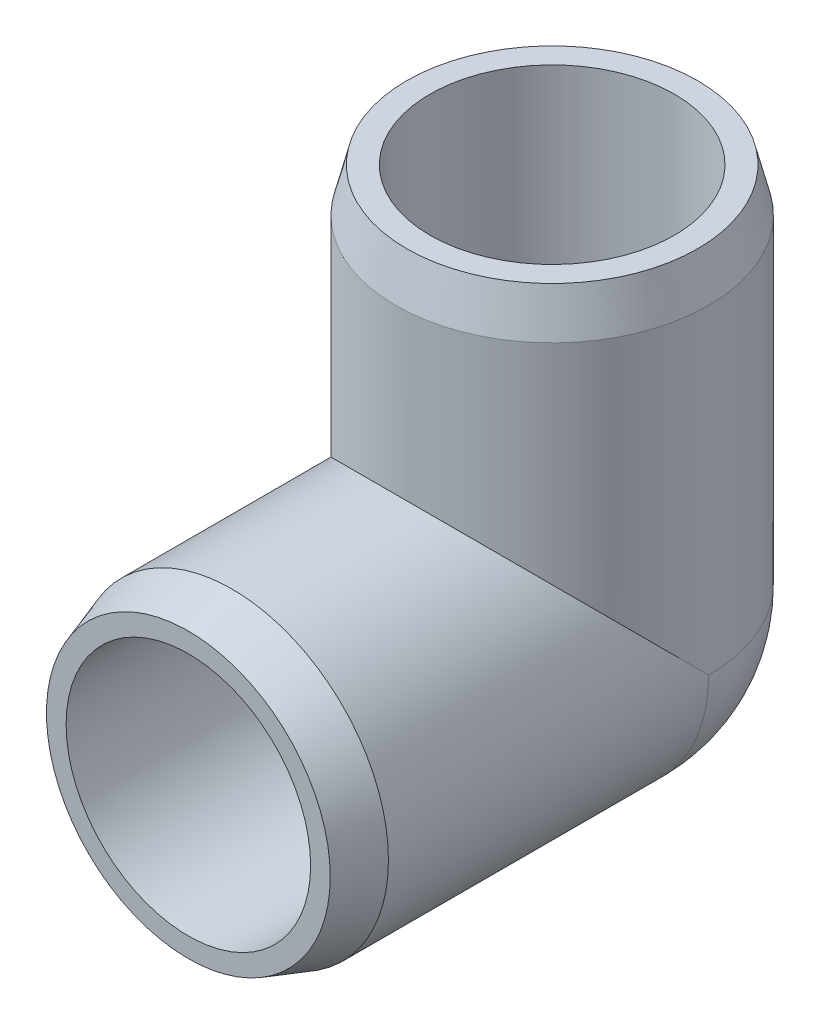
ISO-10303-21;
HEADER;
FILE_DESCRIPTION(('STEP AP214'),'2;1');
FILE_NAME('part.step','',(''),(''),'','','');
FILE_SCHEMA(('AUTOMOTIVE_DESIGN { 1 0 10303 214 1 1 1 1 }'));
ENDSEC;
DATA;
#1=APPLICATION_CONTEXT('core data for automotive mechanical design processes');
#2=APPLICATION_PROTOCOL_DEFINITION('international standard','automotive_design',2000,#1);
#3=PRODUCT_CONTEXT('',#1,'mechanical');
#4=PRODUCT('Part','Part','',(#3));
#5=PRODUCT_RELATED_PRODUCT_CATEGORY('part','',(#4));
#6=PRODUCT_DEFINITION_FORMATION('','',#4);
#7=PRODUCT_DEFINITION_CONTEXT('part definition',#1,'design');
#8=PRODUCT_DEFINITION('design','',#6,#7);
#9=PRODUCT_DEFINITION_SHAPE('','',#8);
#10=(LENGTH_UNIT() NAMED_UNIT(*) SI_UNIT(.MILLI.,.METRE.));
#11=(NAMED_UNIT(*) PLANE_ANGLE_UNIT() SI_UNIT($,.RADIAN.));
#12=(NAMED_UNIT(*) SI_UNIT($,.STERADIAN.) SOLID_ANGLE_UNIT());
#13=UNCERTAINTY_MEASURE_WITH_UNIT(LENGTH_MEASURE(1.E-05),#10,'distance_accuracy_value','');
#14=(GEOMETRIC_REPRESENTATION_CONTEXT(3) GLOBAL_UNCERTAINTY_ASSIGNED_CONTEXT((#13)) GLOBAL_UNIT_ASSIGNED_CONTEXT((#10,
#11,#12)) REPRESENTATION_CONTEXT('',''));
#15=CARTESIAN_POINT('',(0.,0.,0.));
#16=DIRECTION('',(0.,0.,1.));
#17=DIRECTION('',(1.,0.,0.));
#18=AXIS2_PLACEMENT_3D('',#15,#16,#17);
#19=CARTESIAN_POINT('',(0.,13.6525,-13.6535000000001));
#20=DIRECTION('',(0.,0.,1.));
#21=DIRECTION('',(1.,0.,0.));
#22=AXIS2_PLACEMENT_3D('',#19,#20,#21);
#23=CYLINDRICAL_SURFACE('',#22,13.6525);
#24=CARTESIAN_POINT('',(0.,13.6525,0.));
#25=DIRECTION('',(0.,0.,1.));
#26=DIRECTION('',(1.,0.,0.));
#27=AXIS2_PLACEMENT_3D('',#24,#25,#26);
#28=CIRCLE('',#27,13.6525);
#29=CARTESIAN_POINT('',(-13.6525,13.6525,0.));
#30=VERTEX_POINT('',#29);
#31=CARTESIAN_POINT('',(13.6525,13.6525,0.));
#32=VERTEX_POINT('',#31);
#33=EDGE_CURVE('E77',#30,#32,#28,.T.);
#34=ORIENTED_EDGE('',*,*,#33,.T.);
#35=CARTESIAN_POINT('',(0.,13.6525,0.));
#36=DIRECTION('',(0.,0.707106781186548,-0.707106781186547));
#37=DIRECTION('',(0.,0.707106781186548,0.707106781186547));
#38=AXIS2_PLACEMENT_3D('',#35,#36,#37);
#39=ELLIPSE('',#38,19.3075506602987,13.6525);
#40=EDGE_CURVE('E54',#32,#30,#39,.F.);
#41=ORIENTED_EDGE('',*,*,#40,.T.);
#42=EDGE_LOOP('',(#34,#41));
#43=FACE_BOUND('',#42,.T.);
#44=CARTESIAN_POINT('',(1.56818475708975E-13,13.6525,27.9399999999999));
#45=DIRECTION('',(0.,0.,1.));
#46=DIRECTION('',(1.,0.,0.));
#47=AXIS2_PLACEMENT_3D('',#44,#45,#46);
#48=CIRCLE('',#47,13.6525000000002);
#49=CARTESIAN_POINT('',(13.6525000000003,13.6525,27.9399999999996));
#50=VERTEX_POINT('',#49);
#51=EDGE_CURVE('E148',#50,#50,#48,.T.);
#52=ORIENTED_EDGE('',*,*,#51,.F.);
#53=EDGE_LOOP('',(#52));
#54=FACE_BOUND('',#53,.T.);
#55=ADVANCED_FACE('F33',(#43,#54),#23,.T.);
#56=CARTESIAN_POINT('',(2.21709065016539E-13,13.6525,31.75));
#57=DIRECTION('',(0.,0.,-1.));
#58=DIRECTION('',(-1.,0.,0.));
#59=AXIS2_PLACEMENT_3D('',#56,#57,#58);
#60=PLANE('',#59);
#61=CARTESIAN_POINT('',(2.21709065016539E-13,13.6525,31.75));
#62=DIRECTION('',(0.,0.,-1.));
#63=DIRECTION('',(-1.,0.,0.));
#64=AXIS2_PLACEMENT_3D('',#61,#62,#63);
#65=CIRCLE('',#64,10.668);
#66=CARTESIAN_POINT('',(10.6680000000002,13.6525,31.7499999999999));
#67=VERTEX_POINT('',#66);
#68=EDGE_CURVE('E69',#67,#67,#65,.T.);
#69=ORIENTED_EDGE('',*,*,#68,.T.);
#70=EDGE_LOOP('',(#69));
#71=FACE_BOUND('',#70,.T.);
#72=CARTESIAN_POINT('',(2.22044604925029E-13,13.6525,31.7499999999999));
#73=DIRECTION('',(0.,0.,1.));
#74=DIRECTION('',(1.,0.,0.));
#75=AXIS2_PLACEMENT_3D('',#72,#73,#74);
#76=CIRCLE('',#75,12.3825);
#77=CARTESIAN_POINT('',(12.3825000000002,13.6525,31.7499999999997));
#78=VERTEX_POINT('',#77);
#79=EDGE_CURVE('E151',#78,#78,#76,.T.);
#80=ORIENTED_EDGE('',*,*,#79,.T.);
#81=EDGE_LOOP('',(#80));
#82=FACE_BOUND('',#81,.T.);
#83=ADVANCED_FACE('F106',(#71,#82),#60,.F.);
#84=CARTESIAN_POINT('',(0.,50.4548533329512,0.));
#85=DIRECTION('',(0.,1.,0.));
#86=DIRECTION('',(0.,0.,1.));
#87=AXIS2_PLACEMENT_3D('',#84,#85,#86);
#88=CYLINDRICAL_SURFACE('',#87,13.6525);
#89=ORIENTED_EDGE('',*,*,#40,.F.);
#90=CARTESIAN_POINT('',(0.,13.6525,0.));
#91=DIRECTION('',(0.,1.,0.));
#92=DIRECTION('',(0.,0.,1.));
#93=AXIS2_PLACEMENT_3D('',#90,#91,#92);
#94=CIRCLE('',#93,13.6525);
#95=EDGE_CURVE('E75',#32,#30,#94,.T.);
#96=ORIENTED_EDGE('',*,*,#95,.T.);
#97=EDGE_LOOP('',(#89,#96));
#98=FACE_BOUND('',#97,.T.);
#99=CARTESIAN_POINT('',(0.,41.5925,0.));
#100=DIRECTION('',(0.,1.,0.));
#101=DIRECTION('',(0.,0.,1.));
#102=AXIS2_PLACEMENT_3D('',#99,#100,#101);
#103=CIRCLE('',#102,13.6525);
#104=CARTESIAN_POINT('',(0.,41.5925,13.6525));
#105=VERTEX_POINT('',#104);
#106=EDGE_CURVE('E153',#105,#105,#103,.T.);
#107=ORIENTED_EDGE('',*,*,#106,.F.);
#108=EDGE_LOOP('',(#107));
#109=FACE_BOUND('',#108,.T.);
#110=ADVANCED_FACE('F112',(#98,#109),#88,.T.);
#111=CARTESIAN_POINT('',(13.6525,45.4025,0.));
#112=DIRECTION('',(0.,-1.,0.));
#113=DIRECTION('',(0.,0.,-1.));
#114=AXIS2_PLACEMENT_3D('',#111,#112,#113);
#115=PLANE('',#114);
#116=CARTESIAN_POINT('',(0.,45.4025,0.));
#117=DIRECTION('',(0.,1.,0.));
#118=DIRECTION('',(0.,0.,1.));
#119=AXIS2_PLACEMENT_3D('',#116,#117,#118);
#120=CIRCLE('',#119,10.668);
#121=CARTESIAN_POINT('',(0.,45.4025,10.668));
#122=VERTEX_POINT('',#121);
#123=EDGE_CURVE('E72',#122,#122,#120,.T.);
#124=ORIENTED_EDGE('',*,*,#123,.F.);
#125=EDGE_LOOP('',(#124));
#126=FACE_BOUND('',#125,.T.);
#127=CARTESIAN_POINT('',(0.,45.4025,0.));
#128=DIRECTION('',(0.,1.,0.));
#129=DIRECTION('',(0.,0.,1.));
#130=AXIS2_PLACEMENT_3D('',#127,#128,#129);
#131=CIRCLE('',#130,12.7);
#132=CARTESIAN_POINT('',(0.,45.4025,12.7));
#133=VERTEX_POINT('',#132);
#134=EDGE_CURVE('E156',#133,#133,#131,.T.);
#135=ORIENTED_EDGE('',*,*,#134,.T.);
#136=EDGE_LOOP('',(#135));
#137=FACE_BOUND('',#136,.T.);
#138=ADVANCED_FACE('F103',(#126,#137),#115,.F.);
#139=CARTESIAN_POINT('',(0.,13.6525,-13.6535000000001));
#140=DIRECTION('',(0.,0.,1.));
#141=DIRECTION('',(1.,0.,0.));
#142=AXIS2_PLACEMENT_3D('',#139,#140,#141);
#143=CYLINDRICAL_SURFACE('',#142,10.668);
#144=CARTESIAN_POINT('',(0.,13.6525,12.7));
#145=DIRECTION('',(0.,0.,1.));
#146=DIRECTION('',(1.,0.,0.));
#147=AXIS2_PLACEMENT_3D('',#144,#145,#146);
#148=CIRCLE('',#147,10.668);
#149=CARTESIAN_POINT('',(10.6680000000001,13.6525,12.7));
#150=VERTEX_POINT('',#149);
#151=EDGE_CURVE('E11',#150,#150,#148,.T.);
#152=CARTESIAN_POINT('',(10.6680000000001,13.6525,12.7));
#153=CARTESIAN_POINT('',(10.6680000000001,13.6525,12.8984375));
#154=CARTESIAN_POINT('',(10.6680000000001,13.6525,13.096875));
#155=CARTESIAN_POINT('',(10.6680000000001,13.6525,13.49375));
#156=CARTESIAN_POINT('',(10.6680000000001,13.6525,13.6921875));
#157=CARTESIAN_POINT('',(10.6680000000001,13.6525,14.0890625));
#158=CARTESIAN_POINT('',(10.6680000000001,13.6525,14.2875));
#159=CARTESIAN_POINT('',(10.6680000000001,13.6525,14.684375));
#160=CARTESIAN_POINT('',(10.6680000000001,13.6525,14.8828125));
#161=CARTESIAN_POINT('',(10.6680000000001,13.6525,15.2796875));
#162=CARTESIAN_POINT('',(10.6680000000001,13.6525,15.478125));
#163=CARTESIAN_POINT('',(10.6680000000001,13.6525,15.875));
#164=CARTESIAN_POINT('',(10.6680000000001,13.6525,16.0734375));
#165=CARTESIAN_POINT('',(10.6680000000001,13.6525,16.4703125));
#166=CARTESIAN_POINT('',(10.6680000000001,13.6525,16.66875));
#167=CARTESIAN_POINT('',(10.6680000000001,13.6525,17.065625));
#168=CARTESIAN_POINT('',(10.6680000000001,13.6525,17.2640625));
#169=CARTESIAN_POINT('',(10.6680000000001,13.6525,17.6609375));
#170=CARTESIAN_POINT('',(10.6680000000001,13.6525,17.859375));
#171=CARTESIAN_POINT('',(10.6680000000001,13.6525,18.25625));
#172=CARTESIAN_POINT('',(10.6680000000001,13.6525,18.4546875));
#173=CARTESIAN_POINT('',(10.6680000000001,13.6525,18.8515625));
#174=CARTESIAN_POINT('',(10.6680000000001,13.6525,19.05));
#175=CARTESIAN_POINT('',(10.6680000000001,13.6525,19.446875));
#176=CARTESIAN_POINT('',(10.6680000000001,13.6525,19.6453125));
#177=CARTESIAN_POINT('',(10.6680000000001,13.6525,20.0421875));
#178=CARTESIAN_POINT('',(10.6680000000001,13.6525,20.240625));
#179=CARTESIAN_POINT('',(10.6680000000001,13.6525,20.6375));
#180=CARTESIAN_POINT('',(10.6680000000001,13.6525,20.8359375));
#181=CARTESIAN_POINT('',(10.6680000000001,13.6525,21.2328125));
#182=CARTESIAN_POINT('',(10.6680000000001,13.6525,21.43125));
#183=CARTESIAN_POINT('',(10.6680000000002,13.6525,21.828125));
#184=CARTESIAN_POINT('',(10.6680000000002,13.6525,22.0265625));
#185=CARTESIAN_POINT('',(10.6680000000002,13.6525,22.4234375));
#186=CARTESIAN_POINT('',(10.6680000000002,13.6525,22.621875));
#187=CARTESIAN_POINT('',(10.6680000000002,13.6525,23.01875));
#188=CARTESIAN_POINT('',(10.6680000000002,13.6525,23.2171875));
#189=CARTESIAN_POINT('',(10.6680000000002,13.6525,23.6140625));
#190=CARTESIAN_POINT('',(10.6680000000002,13.6525,23.8125));
#191=CARTESIAN_POINT('',(10.6680000000002,13.6525,24.209375));
#192=CARTESIAN_POINT('',(10.6680000000002,13.6525,24.4078125));
#193=CARTESIAN_POINT('',(10.6680000000002,13.6525,24.8046875));
#194=CARTESIAN_POINT('',(10.6680000000002,13.6525,25.003125));
#195=CARTESIAN_POINT('',(10.6680000000002,13.6525,25.4));
#196=CARTESIAN_POINT('',(10.6680000000002,13.6525,25.5984375));
#197=CARTESIAN_POINT('',(10.6680000000002,13.6525,25.9953125));
#198=CARTESIAN_POINT('',(10.6680000000002,13.6525,26.1937499999999));
#199=CARTESIAN_POINT('',(10.6680000000002,13.6525,26.5906249999999));
#200=CARTESIAN_POINT('',(10.6680000000002,13.6525,26.7890625));
#201=CARTESIAN_POINT('',(10.6680000000002,13.6525,27.1859374999999));
#202=CARTESIAN_POINT('',(10.6680000000002,13.6525,27.3843749999999));
#203=CARTESIAN_POINT('',(10.6680000000002,13.6525,27.7812499999999));
#204=CARTESIAN_POINT('',(10.6680000000002,13.6525,27.9796874999999));
#205=CARTESIAN_POINT('',(10.6680000000002,13.6525,28.3765624999999));
#206=CARTESIAN_POINT('',(10.6680000000002,13.6525,28.5749999999999));
#207=CARTESIAN_POINT('',(10.6680000000002,13.6525,28.9718749999999));
#208=CARTESIAN_POINT('',(10.6680000000002,13.6525,29.1703124999999));
#209=CARTESIAN_POINT('',(10.6680000000002,13.6525,29.5671874999999));
#210=CARTESIAN_POINT('',(10.6680000000002,13.6525,29.7656249999999));
#211=CARTESIAN_POINT('',(10.6680000000002,13.6525,30.1624999999999));
#212=CARTESIAN_POINT('',(10.6680000000002,13.6525,30.3609374999999));
#213=CARTESIAN_POINT('',(10.6680000000002,13.6525,30.7578124999999));
#214=CARTESIAN_POINT('',(10.6680000000002,13.6525,30.9562499999999));
#215=CARTESIAN_POINT('',(10.6680000000002,13.6525,31.3531249999999));
#216=CARTESIAN_POINT('',(10.6680000000002,13.6525,31.5515624999999));
#217=CARTESIAN_POINT('',(10.6680000000002,13.6525,31.7499999999999));
#218=B_SPLINE_CURVE_WITH_KNOTS('',3,(#152,#153,#154,#155,#156,#157,#158,#159,#160,#161,#162,
#163,#164,#165,#166,#167,#168,#169,#170,#171,#172,#173,#174,#175,#176,#177,#178,#179,#180,#181,
#182,#183,#184,#185,#186,#187,#188,#189,#190,#191,#192,#193,#194,#195,#196,#197,#198,#199,#200,
#201,#202,#203,#204,#205,#206,#207,#208,#209,#210,#211,#212,#213,#214,#215,#216,#217),
.UNSPECIFIED.,.F.,.F.,(4,2,2,2,2,2,2,2,2,2,2,2,2,2,2,2,2,2,2,2,2,2,2,2,2,2,2,2,2,2,2,2,4),(0.,
0.595312499999997,1.190625,1.78593749999999,2.38124999999999,2.97656249999999,3.57187499999999,
4.16718749999998,4.76249999999998,5.35781249999998,5.95312499999998,6.54843749999997,
7.14374999999997,7.73906249999996,8.33437499999997,8.92968749999997,9.52499999999997,10.1203125,
10.715625,11.3109375,11.90625,12.5015625,13.096875,13.6921874999999,14.2874999999999,
14.8828124999999,15.4781249999999,16.0734374999999,16.6687499999999,17.2640624999999,
17.8593749999999,18.4546874999999,19.0499999999999),.UNSPECIFIED.);
#219=EDGE_CURVE('BSEAM89',#150,#67,#218,.T.);
#220=ORIENTED_EDGE('',*,*,#151,.F.);
#221=ORIENTED_EDGE('',*,*,#68,.F.);
#222=ORIENTED_EDGE('',*,*,#219,.T.);
#223=ORIENTED_EDGE('',*,*,#219,.F.);
#224=EDGE_LOOP('',(#220,#222,#221,#223));
#225=FACE_BOUND('',#224,.T.);
#226=ADVANCED_FACE('F89',(#225),#143,.F.);
#227=CARTESIAN_POINT('',(0.,50.4548533329512,0.));
#228=DIRECTION('',(0.,1.,0.));
#229=DIRECTION('',(0.,0.,1.));
#230=AXIS2_PLACEMENT_3D('',#227,#228,#229);
#231=CYLINDRICAL_SURFACE('',#230,10.668);
#232=CARTESIAN_POINT('',(0.,26.3525,0.));
#233=DIRECTION('',(0.,1.,0.));
#234=DIRECTION('',(0.,0.,1.));
#235=AXIS2_PLACEMENT_3D('',#232,#233,#234);
#236=CIRCLE('',#235,10.668);
#237=CARTESIAN_POINT('',(0.,26.3525,10.668));
#238=VERTEX_POINT('',#237);
#239=EDGE_CURVE('E64',#238,#238,#236,.T.);
#240=ORIENTED_EDGE('',*,*,#239,.F.);
#241=EDGE_LOOP('',(#240));
#242=FACE_BOUND('',#241,.T.);
#243=ORIENTED_EDGE('',*,*,#123,.T.);
#244=EDGE_LOOP('',(#243));
#245=FACE_BOUND('',#244,.T.);
#246=ADVANCED_FACE('F102',(#242,#245),#231,.F.);
#247=CARTESIAN_POINT('',(0.,24.4475,0.));
#248=DIRECTION('',(0.,1.,0.));
#249=DIRECTION('',(0.,0.,1.));
#250=AXIS2_PLACEMENT_3D('',#247,#248,#249);
#251=CIRCLE('',#250,10.668);
#252=CARTESIAN_POINT('',(0.,24.4475,10.668));
#253=VERTEX_POINT('',#252);
#254=EDGE_CURVE('E168',#253,#253,#251,.T.);
#255=ORIENTED_EDGE('',*,*,#254,.T.);
#256=EDGE_LOOP('',(#255));
#257=FACE_BOUND('',#256,.T.);
#258=CARTESIAN_POINT('',(0.,13.6525,0.));
#259=DIRECTION('',(0.,0.707106781186547,-0.707106781186547));
#260=DIRECTION('',(0.,0.707106781186547,0.707106781186547));
#261=AXIS2_PLACEMENT_3D('',#258,#259,#260);
#262=ELLIPSE('',#261,15.0868302833962,10.668);
#263=CARTESIAN_POINT('',(-10.668,13.6525,0.));
#264=VERTEX_POINT('',#263);
#265=CARTESIAN_POINT('',(10.668,13.6525,0.));
#266=VERTEX_POINT('',#265);
#267=EDGE_CURVE('E47',#264,#266,#262,.T.);
#268=ORIENTED_EDGE('',*,*,#267,.F.);
#269=CARTESIAN_POINT('',(0.,13.6525,0.));
#270=DIRECTION('',(0.,1.,0.));
#271=DIRECTION('',(0.,0.,1.));
#272=AXIS2_PLACEMENT_3D('',#269,#270,#271);
#273=CIRCLE('',#272,10.668);
#274=EDGE_CURVE('E68',#266,#264,#273,.T.);
#275=ORIENTED_EDGE('',*,*,#274,.F.);
#276=EDGE_LOOP('',(#268,#275));
#277=FACE_BOUND('',#276,.T.);
#278=ADVANCED_FACE('F67',(#257,#277),#231,.F.);
#279=CARTESIAN_POINT('',(0.,13.6525,0.));
#280=DIRECTION('',(0.,1.,0.));
#281=DIRECTION('',(1.,0.,0.));
#282=AXIS2_PLACEMENT_3D('',#279,#280,#281);
#283=SPHERICAL_SURFACE('',#282,10.668);
#284=CARTESIAN_POINT('',(0.,13.6525,0.));
#285=DIRECTION('',(0.,0.,1.));
#286=DIRECTION('',(1.,0.,0.));
#287=AXIS2_PLACEMENT_3D('',#284,#285,#286);
#288=CIRCLE('',#287,10.668);
#289=EDGE_CURVE('E59',#264,#266,#288,.T.);
#290=ORIENTED_EDGE('',*,*,#289,.T.);
#291=ORIENTED_EDGE('',*,*,#274,.T.);
#292=EDGE_LOOP('',(#290,#291));
#293=FACE_BOUND('',#292,.T.);
#294=ADVANCED_FACE('F71',(#293),#283,.F.);
#295=CARTESIAN_POINT('',(0.,13.6525,0.));
#296=DIRECTION('',(0.,1.,0.));
#297=DIRECTION('',(1.,0.,0.));
#298=AXIS2_PLACEMENT_3D('',#295,#296,#297);
#299=SPHERICAL_SURFACE('',#298,13.6525);
#300=ORIENTED_EDGE('',*,*,#95,.F.);
#301=ORIENTED_EDGE('',*,*,#33,.F.);
#302=EDGE_LOOP('',(#300,#301));
#303=FACE_BOUND('',#302,.T.);
#304=ADVANCED_FACE('F35',(#303),#299,.T.);
#305=CARTESIAN_POINT('',(0.,13.6525,10.795));
#306=DIRECTION('',(0.,0.,-1.));
#307=DIRECTION('',(-1.,0.,0.));
#308=AXIS2_PLACEMENT_3D('',#305,#306,#307);
#309=CIRCLE('',#308,10.668);
#310=CARTESIAN_POINT('',(-10.6679999999999,13.6525,10.795));
#311=VERTEX_POINT('',#310);
#312=EDGE_CURVE('E41',#311,#311,#309,.T.);
#313=ORIENTED_EDGE('',*,*,#312,.F.);
#314=EDGE_LOOP('',(#313));
#315=FACE_BOUND('',#314,.T.);
#316=ORIENTED_EDGE('',*,*,#267,.T.);
#317=ORIENTED_EDGE('',*,*,#289,.F.);
#318=EDGE_LOOP('',(#316,#317));
#319=FACE_BOUND('',#318,.T.);
#320=ADVANCED_FACE('F60',(#315,#319),#143,.F.);
#321=CARTESIAN_POINT('',(-10.668,26.3525,0.));
#322=DIRECTION('',(0.,1.,0.));
#323=DIRECTION('',(0.,0.,1.));
#324=AXIS2_PLACEMENT_3D('',#321,#322,#323);
#325=PLANE('',#324);
#326=ORIENTED_EDGE('',*,*,#239,.T.);
#327=EDGE_LOOP('',(#326));
#328=FACE_BOUND('',#327,.T.);
#329=CARTESIAN_POINT('',(0.,26.3525,0.));
#330=DIRECTION('',(0.,1.,0.));
#331=DIRECTION('',(0.,0.,1.));
#332=AXIS2_PLACEMENT_3D('',#329,#330,#331);
#333=CIRCLE('',#332,9.398);
#334=CARTESIAN_POINT('',(0.,26.3525,9.398));
#335=VERTEX_POINT('',#334);
#336=EDGE_CURVE('E174',#335,#335,#333,.T.);
#337=ORIENTED_EDGE('',*,*,#336,.F.);
#338=EDGE_LOOP('',(#337));
#339=FACE_BOUND('',#338,.T.);
#340=ADVANCED_FACE('F87',(#328,#339),#325,.T.);
#341=CARTESIAN_POINT('',(0.,45.4025,0.));
#342=DIRECTION('',(0.,1.,0.));
#343=DIRECTION('',(0.,0.,1.));
#344=AXIS2_PLACEMENT_3D('',#341,#342,#343);
#345=CYLINDRICAL_SURFACE('',#344,9.398);
#346=ORIENTED_EDGE('',*,*,#336,.T.);
#347=EDGE_LOOP('',(#346));
#348=FACE_BOUND('',#347,.T.);
#349=CARTESIAN_POINT('',(0.,24.4475,0.));
#350=DIRECTION('',(0.,1.,0.));
#351=DIRECTION('',(0.,0.,1.));
#352=AXIS2_PLACEMENT_3D('',#349,#350,#351);
#353=CIRCLE('',#352,9.398);
#354=CARTESIAN_POINT('',(0.,24.4475,9.398));
#355=VERTEX_POINT('',#354);
#356=EDGE_CURVE('E171',#355,#355,#353,.T.);
#357=ORIENTED_EDGE('',*,*,#356,.F.);
#358=EDGE_LOOP('',(#357));
#359=FACE_BOUND('',#358,.T.);
#360=ADVANCED_FACE('F95',(#348,#359),#345,.F.);
#361=CARTESIAN_POINT('',(-9.398,24.4475,0.));
#362=DIRECTION('',(0.,-1.,0.));
#363=DIRECTION('',(0.,0.,-1.));
#364=AXIS2_PLACEMENT_3D('',#361,#362,#363);
#365=PLANE('',#364);
#366=ORIENTED_EDGE('',*,*,#356,.T.);
#367=EDGE_LOOP('',(#366));
#368=FACE_BOUND('',#367,.T.);
#369=ORIENTED_EDGE('',*,*,#254,.F.);
#370=EDGE_LOOP('',(#369));
#371=FACE_BOUND('',#370,.T.);
#372=ADVANCED_FACE('F120',(#368,#371),#365,.T.);
#373=CARTESIAN_POINT('',(0.,2.9845,12.7));
#374=DIRECTION('',(0.,0.,1.));
#375=DIRECTION('',(1.,0.,0.));
#376=AXIS2_PLACEMENT_3D('',#373,#374,#375);
#377=PLANE('',#376);
#378=ORIENTED_EDGE('',*,*,#151,.T.);
#379=EDGE_LOOP('',(#378));
#380=FACE_BOUND('',#379,.T.);
#381=CARTESIAN_POINT('',(0.,13.6525,12.7));
#382=DIRECTION('',(0.,0.,1.));
#383=DIRECTION('',(1.,0.,0.));
#384=AXIS2_PLACEMENT_3D('',#381,#382,#383);
#385=CIRCLE('',#384,9.398);
#386=CARTESIAN_POINT('',(9.398,13.6525,12.7));
#387=VERTEX_POINT('',#386);
#388=EDGE_CURVE('E165',#387,#387,#385,.T.);
#389=ORIENTED_EDGE('',*,*,#388,.F.);
#390=EDGE_LOOP('',(#389));
#391=FACE_BOUND('',#390,.T.);
#392=ADVANCED_FACE('F124',(#380,#391),#377,.T.);
#393=CARTESIAN_POINT('',(0.,13.6525,31.75));
#394=DIRECTION('',(0.,0.,1.));
#395=DIRECTION('',(1.,0.,0.));
#396=AXIS2_PLACEMENT_3D('',#393,#394,#395);
#397=CYLINDRICAL_SURFACE('',#396,9.398);
#398=ORIENTED_EDGE('',*,*,#388,.T.);
#399=EDGE_LOOP('',(#398));
#400=FACE_BOUND('',#399,.T.);
#401=CARTESIAN_POINT('',(0.,13.6525,10.795));
#402=DIRECTION('',(0.,0.,1.));
#403=DIRECTION('',(1.,0.,0.));
#404=AXIS2_PLACEMENT_3D('',#401,#402,#403);
#405=CIRCLE('',#404,9.398);
#406=CARTESIAN_POINT('',(9.398,13.6525,10.795));
#407=VERTEX_POINT('',#406);
#408=EDGE_CURVE('E162',#407,#407,#405,.T.);
#409=ORIENTED_EDGE('',*,*,#408,.F.);
#410=EDGE_LOOP('',(#409));
#411=FACE_BOUND('',#410,.T.);
#412=ADVANCED_FACE('F128',(#400,#411),#397,.F.);
#413=CARTESIAN_POINT('',(0.,4.2545,10.795));
#414=DIRECTION('',(0.,0.,-1.));
#415=DIRECTION('',(-1.,0.,0.));
#416=AXIS2_PLACEMENT_3D('',#413,#414,#415);
#417=PLANE('',#416);
#418=ORIENTED_EDGE('',*,*,#408,.T.);
#419=EDGE_LOOP('',(#418));
#420=FACE_BOUND('',#419,.T.);
#421=ORIENTED_EDGE('',*,*,#312,.T.);
#422=EDGE_LOOP('',(#421));
#423=FACE_BOUND('',#422,.T.);
#424=ADVANCED_FACE('F84',(#420,#423),#417,.T.);
#425=CARTESIAN_POINT('',(0.,45.4025,0.));
#426=DIRECTION('',(0.,-1.,0.));
#427=DIRECTION('',(0.,0.,-1.));
#428=AXIS2_PLACEMENT_3D('',#425,#426,#427);
#429=CONICAL_SURFACE('',#428,12.7,0.244978663126865);
#430=ORIENTED_EDGE('',*,*,#106,.T.);
#431=EDGE_LOOP('',(#430));
#432=FACE_BOUND('',#431,.T.);
#433=ORIENTED_EDGE('',*,*,#134,.F.);
#434=EDGE_LOOP('',(#433));
#435=FACE_BOUND('',#434,.T.);
#436=ADVANCED_FACE('F135',(#432,#435),#429,.T.);
#437=CARTESIAN_POINT('',(2.22044604925029E-13,13.6525,31.7499999999999));
#438=DIRECTION('',(0.,0.,-1.));
#439=DIRECTION('',(-1.,0.,0.));
#440=AXIS2_PLACEMENT_3D('',#437,#438,#439);
#441=CONICAL_SURFACE('',#440,12.3825,0.321750554396678);
#442=ORIENTED_EDGE('',*,*,#51,.T.);
#443=EDGE_LOOP('',(#442));
#444=FACE_BOUND('',#443,.T.);
#445=ORIENTED_EDGE('',*,*,#79,.F.);
#446=EDGE_LOOP('',(#445));
#447=FACE_BOUND('',#446,.T.);
#448=ADVANCED_FACE('F139',(#444,#447),#441,.T.);
#449=CLOSED_SHELL('',(#55,#83,#110,#138,#226,#246,#278,#294,#304,#320,#340,#360,#372,#392,#412,
#424,#436,#448));
#450=MANIFOLD_SOLID_BREP('B2',#449);
#451=ADVANCED_BREP_SHAPE_REPRESENTATION('',(#18,#450),#14);
#452=SHAPE_DEFINITION_REPRESENTATION(#9,#451);
ENDSEC;
END-ISO-10303-21;
